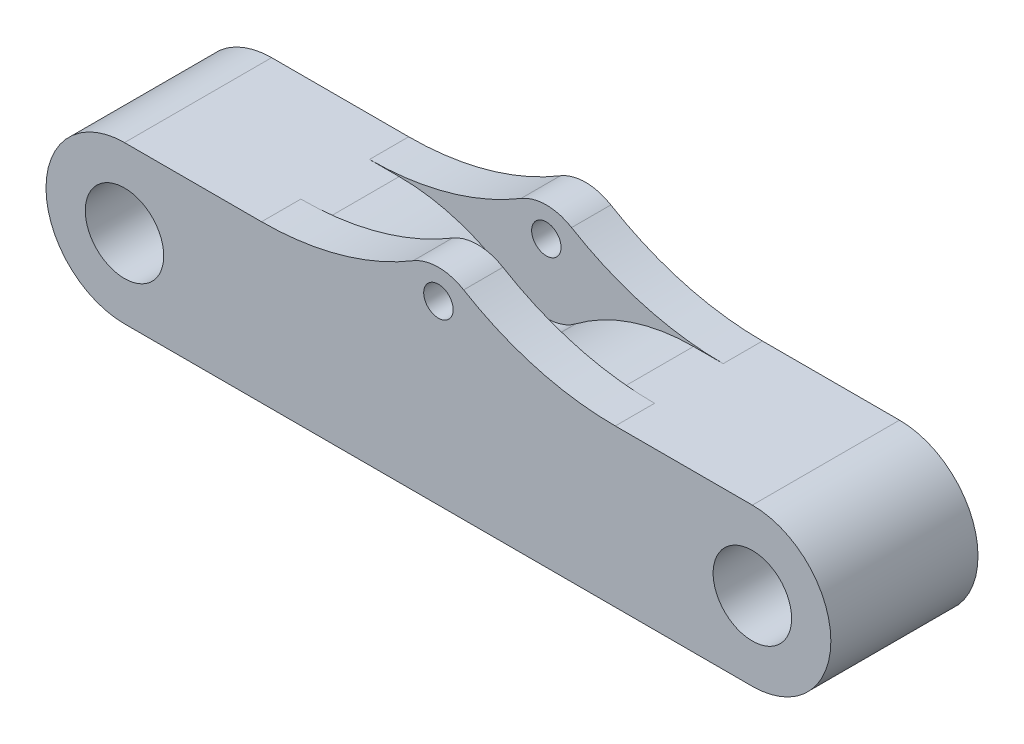
ISO-10303-21;
HEADER;
FILE_DESCRIPTION(('STEP AP214'),'2;1');
FILE_NAME('part.step','',(''),(''),'','','');
FILE_SCHEMA(('AUTOMOTIVE_DESIGN { 1 0 10303 214 1 1 1 1 }'));
ENDSEC;
DATA;
#1=APPLICATION_CONTEXT('core data for automotive mechanical design processes');
#2=APPLICATION_PROTOCOL_DEFINITION('international standard','automotive_design',2000,#1);
#3=PRODUCT_CONTEXT('',#1,'mechanical');
#4=PRODUCT('Part','Part','',(#3));
#5=PRODUCT_RELATED_PRODUCT_CATEGORY('part','',(#4));
#6=PRODUCT_DEFINITION_FORMATION('','',#4);
#7=PRODUCT_DEFINITION_CONTEXT('part definition',#1,'design');
#8=PRODUCT_DEFINITION('design','',#6,#7);
#9=PRODUCT_DEFINITION_SHAPE('','',#8);
#10=(LENGTH_UNIT() NAMED_UNIT(*) SI_UNIT(.MILLI.,.METRE.));
#11=(NAMED_UNIT(*) PLANE_ANGLE_UNIT() SI_UNIT($,.RADIAN.));
#12=(NAMED_UNIT(*) SI_UNIT($,.STERADIAN.) SOLID_ANGLE_UNIT());
#13=UNCERTAINTY_MEASURE_WITH_UNIT(LENGTH_MEASURE(1.E-05),#10,'distance_accuracy_value','');
#14=(GEOMETRIC_REPRESENTATION_CONTEXT(3) GLOBAL_UNCERTAINTY_ASSIGNED_CONTEXT((#13)) GLOBAL_UNIT_ASSIGNED_CONTEXT((#10,
#11,#12)) REPRESENTATION_CONTEXT('',''));
#15=CARTESIAN_POINT('',(0.,0.,0.));
#16=DIRECTION('',(0.,0.,1.));
#17=DIRECTION('',(1.,0.,0.));
#18=AXIS2_PLACEMENT_3D('',#15,#16,#17);
#19=CARTESIAN_POINT('',(18.0277563773199,46.,15.));
#20=DIRECTION('',(0.,0.,-1.));
#21=DIRECTION('',(-1.,0.,0.));
#22=AXIS2_PLACEMENT_3D('',#19,#20,#21);
#23=CYLINDRICAL_SURFACE('',#22,30.);
#24=CARTESIAN_POINT('',(18.0277563773199,46.,4.));
#25=DIRECTION('',(0.,0.,1.));
#26=DIRECTION('',(1.,0.,0.));
#27=AXIS2_PLACEMENT_3D('',#24,#25,#26);
#28=CIRCLE('',#27,30.);
#29=CARTESIAN_POINT('',(18.0277563773199,16.,4.));
#30=VERTEX_POINT('',#29);
#31=CARTESIAN_POINT('',(2.57539376818856,20.2857142857143,4.));
#32=VERTEX_POINT('',#31);
#33=EDGE_CURVE('E225',#30,#32,#28,.F.);
#34=ORIENTED_EDGE('',*,*,#33,.F.);
#35=DIRECTION('',(0.,0.,-1.));
#36=VECTOR('',#35,1.);
#37=CARTESIAN_POINT('',(18.0277563773199,16.,15.));
#38=LINE('',#37,#36);
#39=CARTESIAN_POINT('',(18.0277563773199,16.,0.));
#40=VERTEX_POINT('',#39);
#41=EDGE_CURVE('E179',#30,#40,#38,.T.);
#42=ORIENTED_EDGE('',*,*,#41,.T.);
#43=CARTESIAN_POINT('',(18.0277563773199,46.,0.));
#44=DIRECTION('',(0.,0.,-1.));
#45=DIRECTION('',(1.,0.,0.));
#46=AXIS2_PLACEMENT_3D('',#43,#44,#45);
#47=CIRCLE('',#46,30.);
#48=CARTESIAN_POINT('',(2.57539376818856,20.2857142857143,0.));
#49=VERTEX_POINT('',#48);
#50=EDGE_CURVE('E163',#40,#49,#47,.T.);
#51=ORIENTED_EDGE('',*,*,#50,.T.);
#52=DIRECTION('',(0.,0.,-1.));
#53=VECTOR('',#52,1.);
#54=CARTESIAN_POINT('',(2.57539376818856,20.2857142857143,15.));
#55=LINE('',#54,#53);
#56=EDGE_CURVE('E141',#32,#49,#55,.T.);
#57=ORIENTED_EDGE('',*,*,#56,.F.);
#58=EDGE_LOOP('',(#34,#42,#51,#57));
#59=FACE_BOUND('',#58,.T.);
#60=ADVANCED_FACE('F39',(#59),#23,.F.);
#61=CARTESIAN_POINT('',(0.,16.,15.));
#62=DIRECTION('',(0.,0.,-1.));
#63=DIRECTION('',(-1.,0.,0.));
#64=AXIS2_PLACEMENT_3D('',#61,#62,#63);
#65=CYLINDRICAL_SURFACE('',#64,5.);
#66=DIRECTION('',(0.,0.,-1.));
#67=VECTOR('',#66,1.);
#68=CARTESIAN_POINT('',(-2.57539376818856,20.2857142857143,15.));
#69=LINE('',#68,#67);
#70=CARTESIAN_POINT('',(-2.57539376818856,20.2857142857143,4.));
#71=VERTEX_POINT('',#70);
#72=CARTESIAN_POINT('',(-2.57539376818856,20.2857142857143,0.));
#73=VERTEX_POINT('',#72);
#74=EDGE_CURVE('E142',#71,#73,#69,.T.);
#75=ORIENTED_EDGE('',*,*,#74,.F.);
#76=CARTESIAN_POINT('',(0.,16.,4.));
#77=DIRECTION('',(0.,0.,1.));
#78=DIRECTION('',(1.,0.,0.));
#79=AXIS2_PLACEMENT_3D('',#76,#77,#78);
#80=CIRCLE('',#79,5.);
#81=EDGE_CURVE('E222',#32,#71,#80,.T.);
#82=ORIENTED_EDGE('',*,*,#81,.F.);
#83=ORIENTED_EDGE('',*,*,#56,.T.);
#84=CARTESIAN_POINT('',(0.,16.,0.));
#85=DIRECTION('',(0.,0.,1.));
#86=DIRECTION('',(1.,0.,0.));
#87=AXIS2_PLACEMENT_3D('',#84,#85,#86);
#88=CIRCLE('',#87,5.);
#89=EDGE_CURVE('E166',#49,#73,#88,.T.);
#90=ORIENTED_EDGE('',*,*,#89,.T.);
#91=EDGE_LOOP('',(#75,#82,#83,#90));
#92=FACE_BOUND('',#91,.T.);
#93=ADVANCED_FACE('F344',(#92),#65,.T.);
#94=CARTESIAN_POINT('',(-18.0277563773199,46.,15.));
#95=DIRECTION('',(0.,0.,-1.));
#96=DIRECTION('',(-1.,0.,0.));
#97=AXIS2_PLACEMENT_3D('',#94,#95,#96);
#98=CYLINDRICAL_SURFACE('',#97,30.);
#99=CARTESIAN_POINT('',(-18.0277563773199,46.,4.));
#100=DIRECTION('',(0.,0.,1.));
#101=DIRECTION('',(1.,0.,0.));
#102=AXIS2_PLACEMENT_3D('',#99,#100,#101);
#103=CIRCLE('',#102,30.);
#104=CARTESIAN_POINT('',(-18.0277563773199,16.,4.));
#105=VERTEX_POINT('',#104);
#106=EDGE_CURVE('E220',#71,#105,#103,.F.);
#107=ORIENTED_EDGE('',*,*,#106,.F.);
#108=ORIENTED_EDGE('',*,*,#74,.T.);
#109=CARTESIAN_POINT('',(-18.0277563773199,46.,0.));
#110=DIRECTION('',(0.,0.,-1.));
#111=DIRECTION('',(-1.,0.,0.));
#112=AXIS2_PLACEMENT_3D('',#109,#110,#111);
#113=CIRCLE('',#112,30.);
#114=CARTESIAN_POINT('',(-18.0277563773199,16.,0.));
#115=VERTEX_POINT('',#114);
#116=EDGE_CURVE('E169',#73,#115,#113,.T.);
#117=ORIENTED_EDGE('',*,*,#116,.T.);
#118=DIRECTION('',(0.,0.,-1.));
#119=VECTOR('',#118,1.);
#120=CARTESIAN_POINT('',(-18.0277563773199,16.,15.));
#121=LINE('',#120,#119);
#122=EDGE_CURVE('E175',#105,#115,#121,.T.);
#123=ORIENTED_EDGE('',*,*,#122,.F.);
#124=EDGE_LOOP('',(#107,#108,#117,#123));
#125=FACE_BOUND('',#124,.T.);
#126=ADVANCED_FACE('F346',(#125),#98,.F.);
#127=CARTESIAN_POINT('',(0.,18.,15.));
#128=DIRECTION('',(0.,0.,-1.));
#129=DIRECTION('',(-1.,0.,0.));
#130=AXIS2_PLACEMENT_3D('',#127,#128,#129);
#131=CYLINDRICAL_SURFACE('',#130,1.5);
#132=CARTESIAN_POINT('',(0.,18.,0.));
#133=DIRECTION('',(0.,0.,1.));
#134=DIRECTION('',(1.,0.,0.));
#135=AXIS2_PLACEMENT_3D('',#132,#133,#134);
#136=CIRCLE('',#135,1.5);
#137=CARTESIAN_POINT('',(1.5,18.,0.));
#138=VERTEX_POINT('',#137);
#139=EDGE_CURVE('E232',#138,#138,#136,.T.);
#140=ORIENTED_EDGE('',*,*,#139,.F.);
#141=EDGE_LOOP('',(#140));
#142=FACE_BOUND('',#141,.T.);
#143=CARTESIAN_POINT('',(0.,18.,4.));
#144=DIRECTION('',(0.,0.,1.));
#145=DIRECTION('',(1.,0.,0.));
#146=AXIS2_PLACEMENT_3D('',#143,#144,#145);
#147=CIRCLE('',#146,1.5);
#148=CARTESIAN_POINT('',(1.5,18.,4.));
#149=VERTEX_POINT('',#148);
#150=EDGE_CURVE('E43',#149,#149,#147,.T.);
#151=ORIENTED_EDGE('',*,*,#150,.T.);
#152=EDGE_LOOP('',(#151));
#153=FACE_BOUND('',#152,.T.);
#154=ADVANCED_FACE('F385',(#142,#153),#131,.F.);
#155=CARTESIAN_POINT('',(-32.,8.,15.));
#156=DIRECTION('',(0.,0.,-1.));
#157=DIRECTION('',(-1.,0.,0.));
#158=AXIS2_PLACEMENT_3D('',#155,#156,#157);
#159=PLANE('',#158);
#160=CARTESIAN_POINT('',(-32.,8.,15.));
#161=DIRECTION('',(0.,0.,1.));
#162=DIRECTION('',(-1.,0.,0.));
#163=AXIS2_PLACEMENT_3D('',#160,#161,#162);
#164=CIRCLE('',#163,8.);
#165=CARTESIAN_POINT('',(-32.,16.,15.));
#166=VERTEX_POINT('',#165);
#167=CARTESIAN_POINT('',(-32.,0.,15.));
#168=VERTEX_POINT('',#167);
#169=EDGE_CURVE('E173',#166,#168,#164,.T.);
#170=ORIENTED_EDGE('',*,*,#169,.T.);
#171=DIRECTION('',(1.,0.,0.));
#172=VECTOR('',#171,1.);
#173=CARTESIAN_POINT('',(-32.,0.,15.));
#174=LINE('',#173,#172);
#175=CARTESIAN_POINT('',(32.,0.,15.));
#176=VERTEX_POINT('',#175);
#177=EDGE_CURVE('E103',#168,#176,#174,.T.);
#178=ORIENTED_EDGE('',*,*,#177,.T.);
#179=CARTESIAN_POINT('',(32.,8.,15.));
#180=DIRECTION('',(0.,0.,1.));
#181=DIRECTION('',(1.,0.,0.));
#182=AXIS2_PLACEMENT_3D('',#179,#180,#181);
#183=CIRCLE('',#182,8.);
#184=CARTESIAN_POINT('',(32.,16.,15.));
#185=VERTEX_POINT('',#184);
#186=EDGE_CURVE('E247',#176,#185,#183,.T.);
#187=ORIENTED_EDGE('',*,*,#186,.T.);
#188=DIRECTION('',(-1.,0.,0.));
#189=VECTOR('',#188,1.);
#190=CARTESIAN_POINT('',(18.0277563773199,16.,15.));
#191=LINE('',#190,#189);
#192=CARTESIAN_POINT('',(18.0277563773199,16.,15.));
#193=VERTEX_POINT('',#192);
#194=EDGE_CURVE('E249',#185,#193,#191,.T.);
#195=ORIENTED_EDGE('',*,*,#194,.T.);
#196=CARTESIAN_POINT('',(18.0277563773199,46.,15.));
#197=DIRECTION('',(0.,0.,-1.));
#198=DIRECTION('',(1.,0.,0.));
#199=AXIS2_PLACEMENT_3D('',#196,#197,#198);
#200=CIRCLE('',#199,30.);
#201=CARTESIAN_POINT('',(2.57539376818856,20.2857142857143,15.));
#202=VERTEX_POINT('',#201);
#203=EDGE_CURVE('E126',#193,#202,#200,.T.);
#204=ORIENTED_EDGE('',*,*,#203,.T.);
#205=CARTESIAN_POINT('',(0.,16.,15.));
#206=DIRECTION('',(0.,0.,1.));
#207=DIRECTION('',(1.,0.,0.));
#208=AXIS2_PLACEMENT_3D('',#205,#206,#207);
#209=CIRCLE('',#208,5.);
#210=CARTESIAN_POINT('',(-2.57539376818856,20.2857142857143,15.));
#211=VERTEX_POINT('',#210);
#212=EDGE_CURVE('E118',#202,#211,#209,.T.);
#213=ORIENTED_EDGE('',*,*,#212,.T.);
#214=CARTESIAN_POINT('',(-18.0277563773199,46.,15.));
#215=DIRECTION('',(0.,0.,-1.));
#216=DIRECTION('',(-1.,0.,0.));
#217=AXIS2_PLACEMENT_3D('',#214,#215,#216);
#218=CIRCLE('',#217,30.);
#219=CARTESIAN_POINT('',(-18.0277563773199,16.,15.));
#220=VERTEX_POINT('',#219);
#221=EDGE_CURVE('E123',#211,#220,#218,.T.);
#222=ORIENTED_EDGE('',*,*,#221,.T.);
#223=DIRECTION('',(-1.,0.,0.));
#224=VECTOR('',#223,1.);
#225=CARTESIAN_POINT('',(-32.,16.,15.));
#226=LINE('',#225,#224);
#227=EDGE_CURVE('E65',#220,#166,#226,.T.);
#228=ORIENTED_EDGE('',*,*,#227,.T.);
#229=EDGE_LOOP('',(#170,#178,#187,#195,#204,#213,#222,#228));
#230=FACE_BOUND('',#229,.T.);
#231=CARTESIAN_POINT('',(-32.,8.,15.));
#232=DIRECTION('',(0.,0.,1.));
#233=DIRECTION('',(1.,0.,0.));
#234=AXIS2_PLACEMENT_3D('',#231,#232,#233);
#235=CIRCLE('',#234,4.);
#236=CARTESIAN_POINT('',(-28.,8.,15.));
#237=VERTEX_POINT('',#236);
#238=EDGE_CURVE('E156',#237,#237,#235,.T.);
#239=ORIENTED_EDGE('',*,*,#238,.F.);
#240=EDGE_LOOP('',(#239));
#241=FACE_BOUND('',#240,.T.);
#242=CARTESIAN_POINT('',(0.,18.,15.));
#243=DIRECTION('',(0.,0.,1.));
#244=DIRECTION('',(1.,0.,0.));
#245=AXIS2_PLACEMENT_3D('',#242,#243,#244);
#246=CIRCLE('',#245,1.5);
#247=CARTESIAN_POINT('',(1.5,18.,15.));
#248=VERTEX_POINT('',#247);
#249=EDGE_CURVE('E235',#248,#248,#246,.T.);
#250=ORIENTED_EDGE('',*,*,#249,.F.);
#251=EDGE_LOOP('',(#250));
#252=FACE_BOUND('',#251,.T.);
#253=CARTESIAN_POINT('',(32.,8.,15.));
#254=DIRECTION('',(0.,0.,1.));
#255=DIRECTION('',(1.,0.,0.));
#256=AXIS2_PLACEMENT_3D('',#253,#254,#255);
#257=CIRCLE('',#256,4.);
#258=CARTESIAN_POINT('',(36.,8.,15.));
#259=VERTEX_POINT('',#258);
#260=EDGE_CURVE('E229',#259,#259,#257,.T.);
#261=ORIENTED_EDGE('',*,*,#260,.F.);
#262=EDGE_LOOP('',(#261));
#263=FACE_BOUND('',#262,.T.);
#264=ADVANCED_FACE('F120',(#230,#241,#252,#263),#159,.F.);
#265=CARTESIAN_POINT('',(-32.,8.,0.));
#266=DIRECTION('',(0.,0.,-1.));
#267=DIRECTION('',(-1.,0.,0.));
#268=AXIS2_PLACEMENT_3D('',#265,#266,#267);
#269=PLANE('',#268);
#270=ORIENTED_EDGE('',*,*,#139,.T.);
#271=EDGE_LOOP('',(#270));
#272=FACE_BOUND('',#271,.T.);
#273=CARTESIAN_POINT('',(-32.,8.,0.));
#274=DIRECTION('',(0.,0.,1.));
#275=DIRECTION('',(-1.,0.,0.));
#276=AXIS2_PLACEMENT_3D('',#273,#274,#275);
#277=CIRCLE('',#276,8.);
#278=CARTESIAN_POINT('',(-32.,16.,0.));
#279=VERTEX_POINT('',#278);
#280=CARTESIAN_POINT('',(-32.,0.,0.));
#281=VERTEX_POINT('',#280);
#282=EDGE_CURVE('E152',#279,#281,#277,.T.);
#283=ORIENTED_EDGE('',*,*,#282,.F.);
#284=DIRECTION('',(-1.,0.,0.));
#285=VECTOR('',#284,1.);
#286=CARTESIAN_POINT('',(-32.,16.,0.));
#287=LINE('',#286,#285);
#288=EDGE_CURVE('E95',#115,#279,#287,.T.);
#289=ORIENTED_EDGE('',*,*,#288,.F.);
#290=ORIENTED_EDGE('',*,*,#116,.F.);
#291=ORIENTED_EDGE('',*,*,#89,.F.);
#292=ORIENTED_EDGE('',*,*,#50,.F.);
#293=DIRECTION('',(-1.,0.,0.));
#294=VECTOR('',#293,1.);
#295=CARTESIAN_POINT('',(18.0277563773199,16.,0.));
#296=LINE('',#295,#294);
#297=CARTESIAN_POINT('',(32.,16.,0.));
#298=VERTEX_POINT('',#297);
#299=EDGE_CURVE('E160',#298,#40,#296,.T.);
#300=ORIENTED_EDGE('',*,*,#299,.F.);
#301=CARTESIAN_POINT('',(32.,8.,0.));
#302=DIRECTION('',(0.,0.,1.));
#303=DIRECTION('',(1.,0.,0.));
#304=AXIS2_PLACEMENT_3D('',#301,#302,#303);
#305=CIRCLE('',#304,8.);
#306=CARTESIAN_POINT('',(32.,0.,0.));
#307=VERTEX_POINT('',#306);
#308=EDGE_CURVE('E158',#307,#298,#305,.T.);
#309=ORIENTED_EDGE('',*,*,#308,.F.);
#310=DIRECTION('',(1.,0.,0.));
#311=VECTOR('',#310,1.);
#312=CARTESIAN_POINT('',(-32.,0.,0.));
#313=LINE('',#312,#311);
#314=EDGE_CURVE('E155',#281,#307,#313,.T.);
#315=ORIENTED_EDGE('',*,*,#314,.F.);
#316=EDGE_LOOP('',(#283,#289,#290,#291,#292,#300,#309,#315));
#317=FACE_BOUND('',#316,.T.);
#318=CARTESIAN_POINT('',(-32.,8.,0.));
#319=DIRECTION('',(0.,0.,1.));
#320=DIRECTION('',(1.,0.,0.));
#321=AXIS2_PLACEMENT_3D('',#318,#319,#320);
#322=CIRCLE('',#321,4.);
#323=CARTESIAN_POINT('',(-28.,8.,0.));
#324=VERTEX_POINT('',#323);
#325=EDGE_CURVE('E238',#324,#324,#322,.T.);
#326=ORIENTED_EDGE('',*,*,#325,.T.);
#327=EDGE_LOOP('',(#326));
#328=FACE_BOUND('',#327,.T.);
#329=CARTESIAN_POINT('',(32.,8.,0.));
#330=DIRECTION('',(0.,0.,1.));
#331=DIRECTION('',(1.,0.,0.));
#332=AXIS2_PLACEMENT_3D('',#329,#330,#331);
#333=CIRCLE('',#332,4.);
#334=CARTESIAN_POINT('',(36.,8.,0.));
#335=VERTEX_POINT('',#334);
#336=EDGE_CURVE('E228',#335,#335,#333,.T.);
#337=ORIENTED_EDGE('',*,*,#336,.T.);
#338=EDGE_LOOP('',(#337));
#339=FACE_BOUND('',#338,.T.);
#340=ADVANCED_FACE('F339',(#272,#317,#328,#339),#269,.T.);
#341=CARTESIAN_POINT('',(-32.,8.,15.));
#342=DIRECTION('',(0.,0.,-1.));
#343=DIRECTION('',(-1.,0.,0.));
#344=AXIS2_PLACEMENT_3D('',#341,#342,#343);
#345=CYLINDRICAL_SURFACE('',#344,8.);
#346=ORIENTED_EDGE('',*,*,#282,.T.);
#347=DIRECTION('',(0.,0.,-1.));
#348=VECTOR('',#347,1.);
#349=CARTESIAN_POINT('',(-32.,0.,15.));
#350=LINE('',#349,#348);
#351=EDGE_CURVE('E11',#168,#281,#350,.T.);
#352=ORIENTED_EDGE('',*,*,#351,.F.);
#353=ORIENTED_EDGE('',*,*,#169,.F.);
#354=DIRECTION('',(0.,0.,-1.));
#355=VECTOR('',#354,1.);
#356=CARTESIAN_POINT('',(-32.,16.,15.));
#357=LINE('',#356,#355);
#358=EDGE_CURVE('E148',#166,#279,#357,.T.);
#359=ORIENTED_EDGE('',*,*,#358,.T.);
#360=EDGE_LOOP('',(#346,#352,#353,#359));
#361=FACE_BOUND('',#360,.T.);
#362=ADVANCED_FACE('F41',(#361),#345,.T.);
#363=CARTESIAN_POINT('',(-32.,0.,15.));
#364=DIRECTION('',(0.,1.,0.));
#365=DIRECTION('',(0.,0.,1.));
#366=AXIS2_PLACEMENT_3D('',#363,#364,#365);
#367=PLANE('',#366);
#368=ORIENTED_EDGE('',*,*,#314,.T.);
#369=DIRECTION('',(0.,0.,-1.));
#370=VECTOR('',#369,1.);
#371=CARTESIAN_POINT('',(32.,0.,15.));
#372=LINE('',#371,#370);
#373=EDGE_CURVE('E48',#176,#307,#372,.T.);
#374=ORIENTED_EDGE('',*,*,#373,.F.);
#375=ORIENTED_EDGE('',*,*,#177,.F.);
#376=ORIENTED_EDGE('',*,*,#351,.T.);
#377=EDGE_LOOP('',(#368,#374,#375,#376));
#378=FACE_BOUND('',#377,.T.);
#379=ADVANCED_FACE('F350',(#378),#367,.F.);
#380=CARTESIAN_POINT('',(32.,8.,15.));
#381=DIRECTION('',(0.,0.,-1.));
#382=DIRECTION('',(-1.,0.,0.));
#383=AXIS2_PLACEMENT_3D('',#380,#381,#382);
#384=CYLINDRICAL_SURFACE('',#383,8.);
#385=ORIENTED_EDGE('',*,*,#308,.T.);
#386=DIRECTION('',(0.,0.,-1.));
#387=VECTOR('',#386,1.);
#388=CARTESIAN_POINT('',(32.,16.,15.));
#389=LINE('',#388,#387);
#390=EDGE_CURVE('E183',#185,#298,#389,.T.);
#391=ORIENTED_EDGE('',*,*,#390,.F.);
#392=ORIENTED_EDGE('',*,*,#186,.F.);
#393=ORIENTED_EDGE('',*,*,#373,.T.);
#394=EDGE_LOOP('',(#385,#391,#392,#393));
#395=FACE_BOUND('',#394,.T.);
#396=ADVANCED_FACE('F352',(#395),#384,.T.);
#397=CARTESIAN_POINT('',(18.0277563773199,16.,15.));
#398=DIRECTION('',(0.,-1.,0.));
#399=DIRECTION('',(0.,0.,-1.));
#400=AXIS2_PLACEMENT_3D('',#397,#398,#399);
#401=PLANE('',#400);
#402=ORIENTED_EDGE('',*,*,#299,.T.);
#403=ORIENTED_EDGE('',*,*,#41,.F.);
#404=DIRECTION('',(1.,0.,0.));
#405=VECTOR('',#404,1.);
#406=CARTESIAN_POINT('',(15.,16.,4.));
#407=LINE('',#406,#405);
#408=CARTESIAN_POINT('',(15.,16.,4.));
#409=VERTEX_POINT('',#408);
#410=EDGE_CURVE('E214',#409,#30,#407,.T.);
#411=ORIENTED_EDGE('',*,*,#410,.F.);
#412=DIRECTION('',(0.,0.,1.));
#413=VECTOR('',#412,1.);
#414=CARTESIAN_POINT('',(15.,16.,4.));
#415=LINE('',#414,#413);
#416=CARTESIAN_POINT('',(15.,16.,11.));
#417=VERTEX_POINT('',#416);
#418=EDGE_CURVE('E190',#409,#417,#415,.T.);
#419=ORIENTED_EDGE('',*,*,#418,.T.);
#420=DIRECTION('',(1.,0.,0.));
#421=VECTOR('',#420,1.);
#422=CARTESIAN_POINT('',(15.,16.,11.));
#423=LINE('',#422,#421);
#424=CARTESIAN_POINT('',(18.0277563773199,16.,11.));
#425=VERTEX_POINT('',#424);
#426=EDGE_CURVE('E207',#417,#425,#423,.T.);
#427=ORIENTED_EDGE('',*,*,#426,.T.);
#428=EDGE_CURVE('E180',#193,#425,#38,.T.);
#429=ORIENTED_EDGE('',*,*,#428,.F.);
#430=ORIENTED_EDGE('',*,*,#194,.F.);
#431=ORIENTED_EDGE('',*,*,#390,.T.);
#432=EDGE_LOOP('',(#402,#403,#411,#419,#427,#429,#430,#431));
#433=FACE_BOUND('',#432,.T.);
#434=ADVANCED_FACE('F254',(#433),#401,.F.);
#435=ORIENTED_EDGE('',*,*,#428,.T.);
#436=CARTESIAN_POINT('',(18.0277563773199,46.,11.));
#437=DIRECTION('',(0.,0.,1.));
#438=DIRECTION('',(1.,0.,0.));
#439=AXIS2_PLACEMENT_3D('',#436,#437,#438);
#440=CIRCLE('',#439,30.);
#441=CARTESIAN_POINT('',(2.57539376818856,20.2857142857143,11.));
#442=VERTEX_POINT('',#441);
#443=EDGE_CURVE('E217',#425,#442,#440,.F.);
#444=ORIENTED_EDGE('',*,*,#443,.T.);
#445=EDGE_CURVE('E177',#202,#442,#55,.T.);
#446=ORIENTED_EDGE('',*,*,#445,.F.);
#447=ORIENTED_EDGE('',*,*,#203,.F.);
#448=EDGE_LOOP('',(#435,#444,#446,#447));
#449=FACE_BOUND('',#448,.T.);
#450=ADVANCED_FACE('F257',(#449),#23,.F.);
#451=CARTESIAN_POINT('',(0.,16.,11.));
#452=DIRECTION('',(0.,0.,1.));
#453=DIRECTION('',(1.,0.,0.));
#454=AXIS2_PLACEMENT_3D('',#451,#452,#453);
#455=CIRCLE('',#454,5.);
#456=CARTESIAN_POINT('',(-2.57539376818856,20.2857142857143,11.));
#457=VERTEX_POINT('',#456);
#458=EDGE_CURVE('E137',#442,#457,#455,.T.);
#459=ORIENTED_EDGE('',*,*,#458,.T.);
#460=EDGE_CURVE('E133',#211,#457,#69,.T.);
#461=ORIENTED_EDGE('',*,*,#460,.F.);
#462=ORIENTED_EDGE('',*,*,#212,.F.);
#463=ORIENTED_EDGE('',*,*,#445,.T.);
#464=EDGE_LOOP('',(#459,#461,#462,#463));
#465=FACE_BOUND('',#464,.T.);
#466=ADVANCED_FACE('F134',(#465),#65,.T.);
#467=ORIENTED_EDGE('',*,*,#460,.T.);
#468=CARTESIAN_POINT('',(-18.0277563773199,46.,11.));
#469=DIRECTION('',(0.,0.,1.));
#470=DIRECTION('',(1.,0.,0.));
#471=AXIS2_PLACEMENT_3D('',#468,#469,#470);
#472=CIRCLE('',#471,30.);
#473=CARTESIAN_POINT('',(-18.0277563773199,16.,11.));
#474=VERTEX_POINT('',#473);
#475=EDGE_CURVE('E189',#457,#474,#472,.F.);
#476=ORIENTED_EDGE('',*,*,#475,.T.);
#477=EDGE_CURVE('E146',#220,#474,#121,.T.);
#478=ORIENTED_EDGE('',*,*,#477,.F.);
#479=ORIENTED_EDGE('',*,*,#221,.F.);
#480=EDGE_LOOP('',(#467,#476,#478,#479));
#481=FACE_BOUND('',#480,.T.);
#482=ADVANCED_FACE('F144',(#481),#98,.F.);
#483=CARTESIAN_POINT('',(-32.,16.,15.));
#484=DIRECTION('',(0.,-1.,0.));
#485=DIRECTION('',(0.,0.,-1.));
#486=AXIS2_PLACEMENT_3D('',#483,#484,#485);
#487=PLANE('',#486);
#488=ORIENTED_EDGE('',*,*,#288,.T.);
#489=ORIENTED_EDGE('',*,*,#358,.F.);
#490=ORIENTED_EDGE('',*,*,#227,.F.);
#491=ORIENTED_EDGE('',*,*,#477,.T.);
#492=DIRECTION('',(1.,0.,0.));
#493=VECTOR('',#492,1.);
#494=CARTESIAN_POINT('',(-18.0277563773199,16.,11.));
#495=LINE('',#494,#493);
#496=CARTESIAN_POINT('',(-15.,16.,11.));
#497=VERTEX_POINT('',#496);
#498=EDGE_CURVE('E291',#474,#497,#495,.T.);
#499=ORIENTED_EDGE('',*,*,#498,.T.);
#500=DIRECTION('',(0.,0.,1.));
#501=VECTOR('',#500,1.);
#502=CARTESIAN_POINT('',(-15.,16.,4.));
#503=LINE('',#502,#501);
#504=CARTESIAN_POINT('',(-15.,16.,4.));
#505=VERTEX_POINT('',#504);
#506=EDGE_CURVE('E212',#505,#497,#503,.T.);
#507=ORIENTED_EDGE('',*,*,#506,.F.);
#508=DIRECTION('',(1.,0.,0.));
#509=VECTOR('',#508,1.);
#510=CARTESIAN_POINT('',(-18.0277563773199,16.,4.));
#511=LINE('',#510,#509);
#512=EDGE_CURVE('E56',#105,#505,#511,.T.);
#513=ORIENTED_EDGE('',*,*,#512,.F.);
#514=ORIENTED_EDGE('',*,*,#122,.T.);
#515=EDGE_LOOP('',(#488,#489,#490,#491,#499,#507,#513,#514));
#516=FACE_BOUND('',#515,.T.);
#517=ADVANCED_FACE('F290',(#516),#487,.F.);
#518=CARTESIAN_POINT('',(-32.,8.,15.));
#519=DIRECTION('',(0.,0.,-1.));
#520=DIRECTION('',(-1.,0.,0.));
#521=AXIS2_PLACEMENT_3D('',#518,#519,#520);
#522=CYLINDRICAL_SURFACE('',#521,4.);
#523=ORIENTED_EDGE('',*,*,#238,.T.);
#524=EDGE_LOOP('',(#523));
#525=FACE_BOUND('',#524,.T.);
#526=ORIENTED_EDGE('',*,*,#325,.F.);
#527=EDGE_LOOP('',(#526));
#528=FACE_BOUND('',#527,.T.);
#529=ADVANCED_FACE('F379',(#525,#528),#522,.F.);
#530=CARTESIAN_POINT('',(0.,18.,11.));
#531=DIRECTION('',(0.,0.,1.));
#532=DIRECTION('',(1.,0.,0.));
#533=AXIS2_PLACEMENT_3D('',#530,#531,#532);
#534=CIRCLE('',#533,1.5);
#535=CARTESIAN_POINT('',(1.5,18.,11.));
#536=VERTEX_POINT('',#535);
#537=EDGE_CURVE('E187',#536,#536,#534,.T.);
#538=ORIENTED_EDGE('',*,*,#537,.F.);
#539=EDGE_LOOP('',(#538));
#540=FACE_BOUND('',#539,.T.);
#541=ORIENTED_EDGE('',*,*,#249,.T.);
#542=EDGE_LOOP('',(#541));
#543=FACE_BOUND('',#542,.T.);
#544=ADVANCED_FACE('F387',(#540,#543),#131,.F.);
#545=CARTESIAN_POINT('',(32.,8.,15.));
#546=DIRECTION('',(0.,0.,-1.));
#547=DIRECTION('',(-1.,0.,0.));
#548=AXIS2_PLACEMENT_3D('',#545,#546,#547);
#549=CYLINDRICAL_SURFACE('',#548,4.);
#550=ORIENTED_EDGE('',*,*,#260,.T.);
#551=EDGE_LOOP('',(#550));
#552=FACE_BOUND('',#551,.T.);
#553=ORIENTED_EDGE('',*,*,#336,.F.);
#554=EDGE_LOOP('',(#553));
#555=FACE_BOUND('',#554,.T.);
#556=ADVANCED_FACE('F391',(#552,#555),#549,.F.);
#557=CARTESIAN_POINT('',(-15.,-4.,4.));
#558=DIRECTION('',(0.,0.,1.));
#559=DIRECTION('',(1.,0.,0.));
#560=AXIS2_PLACEMENT_3D('',#557,#558,#559);
#561=PLANE('',#560);
#562=ORIENTED_EDGE('',*,*,#150,.F.);
#563=EDGE_LOOP('',(#562));
#564=FACE_BOUND('',#563,.T.);
#565=ORIENTED_EDGE('',*,*,#33,.T.);
#566=ORIENTED_EDGE('',*,*,#81,.T.);
#567=ORIENTED_EDGE('',*,*,#106,.T.);
#568=ORIENTED_EDGE('',*,*,#512,.T.);
#569=CARTESIAN_POINT('',(-15.,-4.,4.));
#570=DIRECTION('',(0.,0.,-1.));
#571=DIRECTION('',(1.,0.,0.));
#572=AXIS2_PLACEMENT_3D('',#569,#570,#571);
#573=CIRCLE('',#572,20.);
#574=CARTESIAN_POINT('',(-3.,12.,4.));
#575=VERTEX_POINT('',#574);
#576=EDGE_CURVE('E296',#505,#575,#573,.T.);
#577=ORIENTED_EDGE('',*,*,#576,.T.);
#578=CARTESIAN_POINT('',(0.,16.,4.));
#579=DIRECTION('',(0.,0.,1.));
#580=DIRECTION('',(1.,0.,0.));
#581=AXIS2_PLACEMENT_3D('',#578,#579,#580);
#582=CIRCLE('',#581,5.);
#583=CARTESIAN_POINT('',(2.99999999999999,12.,4.));
#584=VERTEX_POINT('',#583);
#585=EDGE_CURVE('E301',#575,#584,#582,.T.);
#586=ORIENTED_EDGE('',*,*,#585,.T.);
#587=CARTESIAN_POINT('',(15.,-4.,4.));
#588=DIRECTION('',(0.,0.,-1.));
#589=DIRECTION('',(-1.,0.,0.));
#590=AXIS2_PLACEMENT_3D('',#587,#588,#589);
#591=CIRCLE('',#590,20.);
#592=EDGE_CURVE('E310',#584,#409,#591,.T.);
#593=ORIENTED_EDGE('',*,*,#592,.T.);
#594=ORIENTED_EDGE('',*,*,#410,.T.);
#595=EDGE_LOOP('',(#565,#566,#567,#568,#577,#586,#593,#594));
#596=FACE_BOUND('',#595,.T.);
#597=ADVANCED_FACE('F303',(#564,#596),#561,.T.);
#598=CARTESIAN_POINT('',(-15.,-4.,11.));
#599=DIRECTION('',(0.,0.,1.));
#600=DIRECTION('',(1.,0.,0.));
#601=AXIS2_PLACEMENT_3D('',#598,#599,#600);
#602=PLANE('',#601);
#603=ORIENTED_EDGE('',*,*,#537,.T.);
#604=EDGE_LOOP('',(#603));
#605=FACE_BOUND('',#604,.T.);
#606=ORIENTED_EDGE('',*,*,#426,.F.);
#607=CARTESIAN_POINT('',(15.,-4.,11.));
#608=DIRECTION('',(0.,0.,-1.));
#609=DIRECTION('',(-1.,0.,0.));
#610=AXIS2_PLACEMENT_3D('',#607,#608,#609);
#611=CIRCLE('',#610,20.);
#612=CARTESIAN_POINT('',(2.99999999999999,12.,11.));
#613=VERTEX_POINT('',#612);
#614=EDGE_CURVE('E307',#613,#417,#611,.T.);
#615=ORIENTED_EDGE('',*,*,#614,.F.);
#616=CARTESIAN_POINT('',(0.,16.,11.));
#617=DIRECTION('',(0.,0.,1.));
#618=DIRECTION('',(1.,0.,0.));
#619=AXIS2_PLACEMENT_3D('',#616,#617,#618);
#620=CIRCLE('',#619,5.);
#621=CARTESIAN_POINT('',(-3.,12.,11.));
#622=VERTEX_POINT('',#621);
#623=EDGE_CURVE('E317',#622,#613,#620,.T.);
#624=ORIENTED_EDGE('',*,*,#623,.F.);
#625=CARTESIAN_POINT('',(-15.,-4.,11.));
#626=DIRECTION('',(0.,0.,-1.));
#627=DIRECTION('',(1.,0.,0.));
#628=AXIS2_PLACEMENT_3D('',#625,#626,#627);
#629=CIRCLE('',#628,20.);
#630=EDGE_CURVE('E315',#497,#622,#629,.T.);
#631=ORIENTED_EDGE('',*,*,#630,.F.);
#632=ORIENTED_EDGE('',*,*,#498,.F.);
#633=ORIENTED_EDGE('',*,*,#475,.F.);
#634=ORIENTED_EDGE('',*,*,#458,.F.);
#635=ORIENTED_EDGE('',*,*,#443,.F.);
#636=EDGE_LOOP('',(#606,#615,#624,#631,#632,#633,#634,#635));
#637=FACE_BOUND('',#636,.T.);
#638=ADVANCED_FACE('F325',(#605,#637),#602,.F.);
#639=CARTESIAN_POINT('',(15.,-4.,4.));
#640=DIRECTION('',(0.,0.,1.));
#641=DIRECTION('',(1.,0.,0.));
#642=AXIS2_PLACEMENT_3D('',#639,#640,#641);
#643=CYLINDRICAL_SURFACE('',#642,20.);
#644=ORIENTED_EDGE('',*,*,#614,.T.);
#645=ORIENTED_EDGE('',*,*,#418,.F.);
#646=ORIENTED_EDGE('',*,*,#592,.F.);
#647=DIRECTION('',(0.,0.,1.));
#648=VECTOR('',#647,1.);
#649=CARTESIAN_POINT('',(2.99999999999999,12.,4.));
#650=LINE('',#649,#648);
#651=EDGE_CURVE('E195',#584,#613,#650,.T.);
#652=ORIENTED_EDGE('',*,*,#651,.T.);
#653=EDGE_LOOP('',(#644,#645,#646,#652));
#654=FACE_BOUND('',#653,.T.);
#655=ADVANCED_FACE('F322',(#654),#643,.T.);
#656=CARTESIAN_POINT('',(0.,16.,4.));
#657=DIRECTION('',(0.,0.,1.));
#658=DIRECTION('',(1.,0.,0.));
#659=AXIS2_PLACEMENT_3D('',#656,#657,#658);
#660=CYLINDRICAL_SURFACE('',#659,5.);
#661=ORIENTED_EDGE('',*,*,#623,.T.);
#662=ORIENTED_EDGE('',*,*,#651,.F.);
#663=ORIENTED_EDGE('',*,*,#585,.F.);
#664=DIRECTION('',(0.,0.,1.));
#665=VECTOR('',#664,1.);
#666=CARTESIAN_POINT('',(-3.,12.,4.));
#667=LINE('',#666,#665);
#668=EDGE_CURVE('E204',#575,#622,#667,.T.);
#669=ORIENTED_EDGE('',*,*,#668,.T.);
#670=EDGE_LOOP('',(#661,#662,#663,#669));
#671=FACE_BOUND('',#670,.T.);
#672=ADVANCED_FACE('F327',(#671),#660,.F.);
#673=CARTESIAN_POINT('',(-15.,-4.,4.));
#674=DIRECTION('',(0.,0.,1.));
#675=DIRECTION('',(1.,0.,0.));
#676=AXIS2_PLACEMENT_3D('',#673,#674,#675);
#677=CYLINDRICAL_SURFACE('',#676,20.);
#678=ORIENTED_EDGE('',*,*,#630,.T.);
#679=ORIENTED_EDGE('',*,*,#668,.F.);
#680=ORIENTED_EDGE('',*,*,#576,.F.);
#681=ORIENTED_EDGE('',*,*,#506,.T.);
#682=EDGE_LOOP('',(#678,#679,#680,#681));
#683=FACE_BOUND('',#682,.T.);
#684=ADVANCED_FACE('F297',(#683),#677,.T.);
#685=CLOSED_SHELL('',(#60,#93,#126,#154,#264,#340,#362,#379,#396,#434,#450,#466,#482,#517,#529,
#544,#556,#597,#638,#655,#672,#684));
#686=MANIFOLD_SOLID_BREP('B2',#685);
#687=ADVANCED_BREP_SHAPE_REPRESENTATION('',(#18,#686),#14);
#688=SHAPE_DEFINITION_REPRESENTATION(#9,#687);
ENDSEC;
END-ISO-10303-21;
